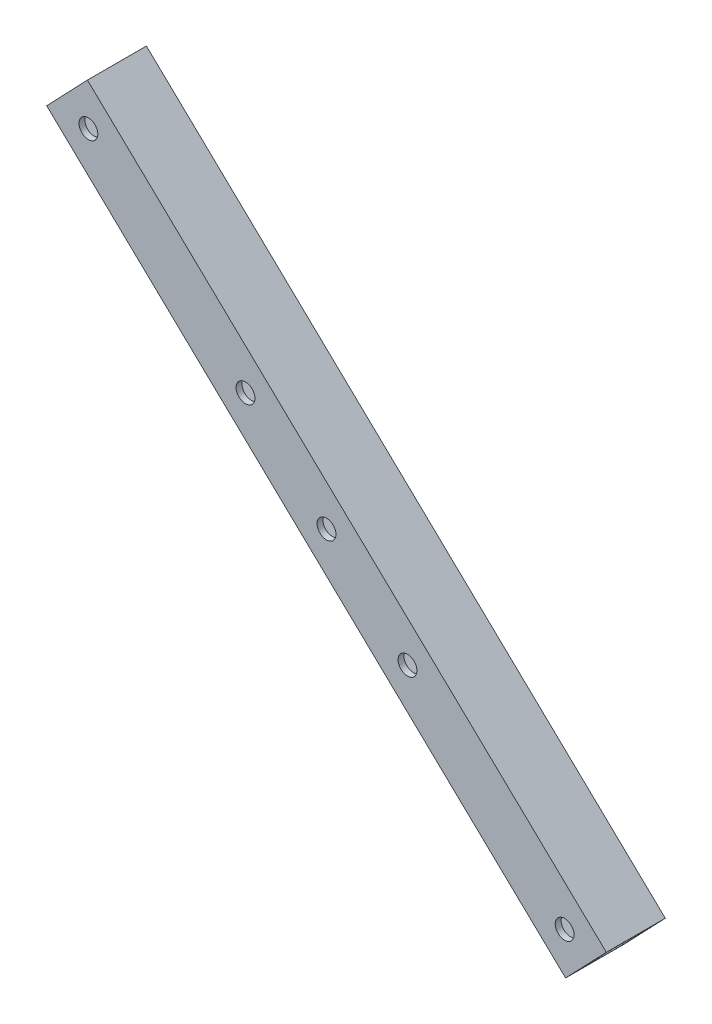
ISO-10303-21;
HEADER;
FILE_DESCRIPTION(('STEP AP214'),'2;1');
FILE_NAME('part.step','',(''),(''),'','','');
FILE_SCHEMA(('AUTOMOTIVE_DESIGN { 1 0 10303 214 1 1 1 1 }'));
ENDSEC;
DATA;
#1=APPLICATION_CONTEXT('core data for automotive mechanical design processes');
#2=APPLICATION_PROTOCOL_DEFINITION('international standard','automotive_design',2000,#1);
#3=PRODUCT_CONTEXT('',#1,'mechanical');
#4=PRODUCT('Part','Part','',(#3));
#5=PRODUCT_RELATED_PRODUCT_CATEGORY('part','',(#4));
#6=PRODUCT_DEFINITION_FORMATION('','',#4);
#7=PRODUCT_DEFINITION_CONTEXT('part definition',#1,'design');
#8=PRODUCT_DEFINITION('design','',#6,#7);
#9=PRODUCT_DEFINITION_SHAPE('','',#8);
#10=(LENGTH_UNIT() NAMED_UNIT(*) SI_UNIT(.MILLI.,.METRE.));
#11=(NAMED_UNIT(*) PLANE_ANGLE_UNIT() SI_UNIT($,.RADIAN.));
#12=(NAMED_UNIT(*) SI_UNIT($,.STERADIAN.) SOLID_ANGLE_UNIT());
#13=UNCERTAINTY_MEASURE_WITH_UNIT(LENGTH_MEASURE(1.E-05),#10,'distance_accuracy_value','');
#14=(GEOMETRIC_REPRESENTATION_CONTEXT(3) GLOBAL_UNCERTAINTY_ASSIGNED_CONTEXT((#13)) GLOBAL_UNIT_ASSIGNED_CONTEXT((#10,
#11,#12)) REPRESENTATION_CONTEXT('',''));
#15=CARTESIAN_POINT('',(0.,0.,0.));
#16=DIRECTION('',(0.,0.,1.));
#17=DIRECTION('',(1.,0.,0.));
#18=AXIS2_PLACEMENT_3D('',#15,#16,#17);
#19=CARTESIAN_POINT('',(-3.77609817293488,84.2848181798707,10.));
#20=DIRECTION('',(0.,0.,-1.));
#21=DIRECTION('',(-1.,0.,0.));
#22=AXIS2_PLACEMENT_3D('',#19,#20,#21);
#23=CYLINDRICAL_SURFACE('',#22,1.6);
#24=CARTESIAN_POINT('',(-3.77609817293488,84.2848181798707,9.));
#25=DIRECTION('',(0.,0.,1.));
#26=DIRECTION('',(1.,0.,0.));
#27=AXIS2_PLACEMENT_3D('',#24,#25,#26);
#28=CIRCLE('',#27,1.6);
#29=CARTESIAN_POINT('',(-2.17609817293488,84.2848181798707,9.));
#30=VERTEX_POINT('',#29);
#31=EDGE_CURVE('E134',#30,#30,#28,.T.);
#32=ORIENTED_EDGE('',*,*,#31,.F.);
#33=EDGE_LOOP('',(#32));
#34=FACE_BOUND('',#33,.T.);
#35=CARTESIAN_POINT('',(-3.77609817293488,84.2848181798707,10.));
#36=DIRECTION('',(0.,0.,1.));
#37=DIRECTION('',(1.,0.,0.));
#38=AXIS2_PLACEMENT_3D('',#35,#36,#37);
#39=CIRCLE('',#38,1.6);
#40=CARTESIAN_POINT('',(-2.17609817293488,84.2848181798707,10.));
#41=VERTEX_POINT('',#40);
#42=EDGE_CURVE('E144',#41,#41,#39,.T.);
#43=ORIENTED_EDGE('',*,*,#42,.T.);
#44=EDGE_LOOP('',(#43));
#45=FACE_BOUND('',#44,.T.);
#46=ADVANCED_FACE('F33',(#34,#45),#23,.F.);
#47=CARTESIAN_POINT('',(76.990408140841,7.09173909976924,10.));
#48=DIRECTION('',(0.,0.,-1.));
#49=DIRECTION('',(-1.,0.,0.));
#50=AXIS2_PLACEMENT_3D('',#47,#48,#49);
#51=CYLINDRICAL_SURFACE('',#50,1.60000000000001);
#52=CARTESIAN_POINT('',(76.990408140841,7.09173909976924,9.));
#53=DIRECTION('',(0.,0.,1.));
#54=DIRECTION('',(1.,0.,0.));
#55=AXIS2_PLACEMENT_3D('',#52,#53,#54);
#56=CIRCLE('',#55,1.60000000000001);
#57=CARTESIAN_POINT('',(78.590408140841,7.09173909976924,9.));
#58=VERTEX_POINT('',#57);
#59=EDGE_CURVE('E133',#58,#58,#56,.T.);
#60=ORIENTED_EDGE('',*,*,#59,.F.);
#61=EDGE_LOOP('',(#60));
#62=FACE_BOUND('',#61,.T.);
#63=CARTESIAN_POINT('',(76.990408140841,7.09173909976924,10.));
#64=DIRECTION('',(0.,0.,1.));
#65=DIRECTION('',(1.,0.,0.));
#66=AXIS2_PLACEMENT_3D('',#63,#64,#65);
#67=CIRCLE('',#66,1.60000000000001);
#68=CARTESIAN_POINT('',(78.590408140841,7.09173909976924,10.));
#69=VERTEX_POINT('',#68);
#70=EDGE_CURVE('E141',#69,#69,#67,.T.);
#71=ORIENTED_EDGE('',*,*,#70,.T.);
#72=EDGE_LOOP('',(#71));
#73=FACE_BOUND('',#72,.T.);
#74=ADVANCED_FACE('F235',(#62,#73),#51,.F.);
#75=CARTESIAN_POINT('',(40.3083714708663,-38.5249709137162,10.));
#76=DIRECTION('',(-0.722918282369836,0.690933540230496,0.));
#77=DIRECTION('',(-0.690933540230496,-0.722918282369836,0.));
#78=AXIS2_PLACEMENT_3D('',#75,#76,#77);
#79=PLANE('',#78);
#80=DIRECTION('',(0.,0.,-1.));
#81=VECTOR('',#80,1.);
#82=CARTESIAN_POINT('',(77.8412653917682,0.745398269137436,9.));
#83=LINE('',#82,#81);
#84=CARTESIAN_POINT('',(77.8412653917682,0.745398269137436,9.));
#85=VERTEX_POINT('',#84);
#86=CARTESIAN_POINT('',(77.8412653917682,0.745398269137436,1.));
#87=VERTEX_POINT('',#86);
#88=EDGE_CURVE('E112',#85,#87,#83,.T.);
#89=ORIENTED_EDGE('',*,*,#88,.F.);
#90=DIRECTION('',(-0.690933540230497,-0.722918282369835,0.));
#91=VECTOR('',#90,1.);
#92=CARTESIAN_POINT('',(77.8412653917682,0.745398269137436,9.));
#93=LINE('',#92,#91);
#94=CARTESIAN_POINT('',(83.3687337136122,6.52874452809612,9.));
#95=VERTEX_POINT('',#94);
#96=EDGE_CURVE('E50',#95,#85,#93,.T.);
#97=ORIENTED_EDGE('',*,*,#96,.F.);
#98=DIRECTION('',(0.,0.,1.));
#99=VECTOR('',#98,1.);
#100=CARTESIAN_POINT('',(83.3687337136122,6.52874452809612,9.));
#101=LINE('',#100,#99);
#102=CARTESIAN_POINT('',(83.3687337136122,6.52874452809612,1.));
#103=VERTEX_POINT('',#102);
#104=EDGE_CURVE('E119',#103,#95,#101,.T.);
#105=ORIENTED_EDGE('',*,*,#104,.F.);
#106=DIRECTION('',(0.690933540230497,0.722918282369835,0.));
#107=VECTOR('',#106,1.);
#108=CARTESIAN_POINT('',(77.8412653917682,0.745398269137436,1.));
#109=LINE('',#108,#107);
#110=EDGE_CURVE('E103',#87,#103,#109,.T.);
#111=ORIENTED_EDGE('',*,*,#110,.F.);
#112=EDGE_LOOP('',(#89,#97,#105,#111));
#113=FACE_BOUND('',#112,.T.);
#114=DIRECTION('',(0.690933540230496,0.722918282369836,0.));
#115=VECTOR('',#114,1.);
#116=CARTESIAN_POINT('',(40.3083714708663,-38.5249709137162,0.));
#117=LINE('',#116,#115);
#118=CARTESIAN_POINT('',(77.1503318515377,0.0224799867676109,0.));
#119=VERTEX_POINT('',#118);
#120=CARTESIAN_POINT('',(84.0596672538427,7.25166281046594,0.));
#121=VERTEX_POINT('',#120);
#122=EDGE_CURVE('E163',#119,#121,#117,.T.);
#123=ORIENTED_EDGE('',*,*,#122,.T.);
#124=DIRECTION('',(0.,0.,-1.));
#125=VECTOR('',#124,1.);
#126=CARTESIAN_POINT('',(84.0596672538427,7.25166281046594,10.));
#127=LINE('',#126,#125);
#128=CARTESIAN_POINT('',(84.0596672538427,7.25166281046594,10.));
#129=VERTEX_POINT('',#128);
#130=EDGE_CURVE('E179',#129,#121,#127,.T.);
#131=ORIENTED_EDGE('',*,*,#130,.F.);
#132=DIRECTION('',(0.690933540230496,0.722918282369836,0.));
#133=VECTOR('',#132,1.);
#134=CARTESIAN_POINT('',(40.3083714708663,-38.5249709137162,10.));
#135=LINE('',#134,#133);
#136=CARTESIAN_POINT('',(77.1503318515377,0.0224799867676109,10.));
#137=VERTEX_POINT('',#136);
#138=EDGE_CURVE('E148',#137,#129,#135,.T.);
#139=ORIENTED_EDGE('',*,*,#138,.F.);
#140=DIRECTION('',(0.,0.,-1.));
#141=VECTOR('',#140,1.);
#142=CARTESIAN_POINT('',(77.1503318515377,0.0224799867676109,10.));
#143=LINE('',#142,#141);
#144=EDGE_CURVE('E157',#137,#119,#143,.T.);
#145=ORIENTED_EDGE('',*,*,#144,.T.);
#146=EDGE_LOOP('',(#123,#131,#139,#145));
#147=FACE_BOUND('',#146,.T.);
#148=ADVANCED_FACE('F116',(#113,#147),#79,.F.);
#149=CARTESIAN_POINT('',(43.7512957829762,45.7766337241822,10.));
#150=DIRECTION('',(-0.690933540230495,-0.722918282369837,0.));
#151=DIRECTION('',(0.722918282369837,-0.690933540230495,0.));
#152=AXIS2_PLACEMENT_3D('',#149,#150,#151);
#153=PLANE('',#152);
#154=DIRECTION('',(-0.722918282369837,0.690933540230495,0.));
#155=VECTOR('',#154,1.);
#156=CARTESIAN_POINT('',(43.7512957829762,45.7766337241822,0.));
#157=LINE('',#156,#155);
#158=CARTESIAN_POINT('',(-3.93602188363157,91.3540772928723,0.));
#159=VERTEX_POINT('',#158);
#160=EDGE_CURVE('E166',#121,#159,#157,.T.);
#161=ORIENTED_EDGE('',*,*,#160,.T.);
#162=DIRECTION('',(0.,0.,-1.));
#163=VECTOR('',#162,1.);
#164=CARTESIAN_POINT('',(-3.93602188363157,91.3540772928723,10.));
#165=LINE('',#164,#163);
#166=CARTESIAN_POINT('',(-3.93602188363157,91.3540772928723,10.));
#167=VERTEX_POINT('',#166);
#168=EDGE_CURVE('E176',#167,#159,#165,.T.);
#169=ORIENTED_EDGE('',*,*,#168,.F.);
#170=DIRECTION('',(-0.722918282369837,0.690933540230495,0.));
#171=VECTOR('',#170,1.);
#172=CARTESIAN_POINT('',(43.7512957829762,45.7766337241822,10.));
#173=LINE('',#172,#171);
#174=EDGE_CURVE('E151',#129,#167,#173,.T.);
#175=ORIENTED_EDGE('',*,*,#174,.F.);
#176=ORIENTED_EDGE('',*,*,#130,.T.);
#177=EDGE_LOOP('',(#161,#169,#175,#176));
#178=FACE_BOUND('',#177,.T.);
#179=ADVANCED_FACE('F254',(#178),#153,.F.);
#180=CARTESIAN_POINT('',(-47.6873176666079,45.5774435686902,10.));
#181=DIRECTION('',(0.722918282369836,-0.690933540230496,0.));
#182=DIRECTION('',(0.690933540230496,0.722918282369836,0.));
#183=AXIS2_PLACEMENT_3D('',#180,#181,#182);
#184=PLANE('',#183);
#185=DIRECTION('',(0.,0.,1.));
#186=VECTOR('',#185,1.);
#187=CARTESIAN_POINT('',(-4.626955423862,90.6311590105026,10.));
#188=LINE('',#187,#186);
#189=CARTESIAN_POINT('',(-4.626955423862,90.6311590105026,1.));
#190=VERTEX_POINT('',#189);
#191=CARTESIAN_POINT('',(-4.626955423862,90.6311590105026,9.));
#192=VERTEX_POINT('',#191);
#193=EDGE_CURVE('E11',#190,#192,#188,.T.);
#194=ORIENTED_EDGE('',*,*,#193,.T.);
#195=DIRECTION('',(-0.690933540230496,-0.722918282369836,0.));
#196=VECTOR('',#195,1.);
#197=CARTESIAN_POINT('',(-47.6873176666079,45.5774435686902,9.));
#198=LINE('',#197,#196);
#199=CARTESIAN_POINT('',(-10.154423745706,84.8478127515439,9.));
#200=VERTEX_POINT('',#199);
#201=EDGE_CURVE('E137',#192,#200,#198,.T.);
#202=ORIENTED_EDGE('',*,*,#201,.T.);
#203=DIRECTION('',(0.,0.,-1.));
#204=VECTOR('',#203,1.);
#205=CARTESIAN_POINT('',(-10.154423745706,84.8478127515439,10.));
#206=LINE('',#205,#204);
#207=CARTESIAN_POINT('',(-10.154423745706,84.8478127515439,1.));
#208=VERTEX_POINT('',#207);
#209=EDGE_CURVE('E42',#200,#208,#206,.T.);
#210=ORIENTED_EDGE('',*,*,#209,.T.);
#211=DIRECTION('',(0.690933540230496,0.722918282369836,0.));
#212=VECTOR('',#211,1.);
#213=CARTESIAN_POINT('',(-47.6873176666079,45.5774435686902,1.));
#214=LINE('',#213,#212);
#215=EDGE_CURVE('E106',#208,#190,#214,.T.);
#216=ORIENTED_EDGE('',*,*,#215,.T.);
#217=EDGE_LOOP('',(#194,#202,#210,#216));
#218=FACE_BOUND('',#217,.T.);
#219=DIRECTION('',(-0.690933540230496,-0.722918282369836,0.));
#220=VECTOR('',#219,1.);
#221=CARTESIAN_POINT('',(-47.6873176666079,45.5774435686902,0.));
#222=LINE('',#221,#220);
#223=CARTESIAN_POINT('',(-10.8453572859366,84.124894469174,0.));
#224=VERTEX_POINT('',#223);
#225=EDGE_CURVE('E168',#159,#224,#222,.T.);
#226=ORIENTED_EDGE('',*,*,#225,.T.);
#227=DIRECTION('',(0.,0.,-1.));
#228=VECTOR('',#227,1.);
#229=CARTESIAN_POINT('',(-10.8453572859366,84.124894469174,10.));
#230=LINE('',#229,#228);
#231=CARTESIAN_POINT('',(-10.8453572859366,84.124894469174,10.));
#232=VERTEX_POINT('',#231);
#233=EDGE_CURVE('E173',#232,#224,#230,.T.);
#234=ORIENTED_EDGE('',*,*,#233,.F.);
#235=DIRECTION('',(-0.690933540230496,-0.722918282369836,0.));
#236=VECTOR('',#235,1.);
#237=CARTESIAN_POINT('',(-47.6873176666079,45.5774435686902,10.));
#238=LINE('',#237,#236);
#239=EDGE_CURVE('E153',#167,#232,#238,.T.);
#240=ORIENTED_EDGE('',*,*,#239,.F.);
#241=ORIENTED_EDGE('',*,*,#168,.T.);
#242=EDGE_LOOP('',(#226,#234,#240,#241));
#243=FACE_BOUND('',#242,.T.);
#244=ADVANCED_FACE('F246',(#218,#243),#184,.F.);
#245=CARTESIAN_POINT('',(-3.77609817293488,84.2848181798707,1.));
#246=DIRECTION('',(0.,0.,-1.));
#247=DIRECTION('',(-1.,0.,0.));
#248=AXIS2_PLACEMENT_3D('',#245,#246,#247);
#249=CIRCLE('',#248,1.6);
#250=CARTESIAN_POINT('',(-5.37609817293488,84.2848181798707,1.));
#251=VERTEX_POINT('',#250);
#252=EDGE_CURVE('E129',#251,#251,#249,.T.);
#253=ORIENTED_EDGE('',*,*,#252,.F.);
#254=EDGE_LOOP('',(#253));
#255=FACE_BOUND('',#254,.T.);
#256=CARTESIAN_POINT('',(-3.77609817293488,84.2848181798707,0.));
#257=DIRECTION('',(0.,0.,1.));
#258=DIRECTION('',(1.,0.,0.));
#259=AXIS2_PLACEMENT_3D('',#256,#257,#258);
#260=CIRCLE('',#259,1.6);
#261=CARTESIAN_POINT('',(-2.17609817293488,84.2848181798707,0.));
#262=VERTEX_POINT('',#261);
#263=EDGE_CURVE('E160',#262,#262,#260,.T.);
#264=ORIENTED_EDGE('',*,*,#263,.F.);
#265=EDGE_LOOP('',(#264));
#266=FACE_BOUND('',#265,.T.);
#267=ADVANCED_FACE('F237',(#255,#266),#23,.F.);
#268=CARTESIAN_POINT('',(76.990408140841,7.09173909976924,1.));
#269=DIRECTION('',(0.,0.,-1.));
#270=DIRECTION('',(-1.,0.,0.));
#271=AXIS2_PLACEMENT_3D('',#268,#269,#270);
#272=CIRCLE('',#271,1.60000000000001);
#273=CARTESIAN_POINT('',(75.390408140841,7.09173909976924,1.));
#274=VERTEX_POINT('',#273);
#275=EDGE_CURVE('E126',#274,#274,#272,.T.);
#276=ORIENTED_EDGE('',*,*,#275,.F.);
#277=EDGE_LOOP('',(#276));
#278=FACE_BOUND('',#277,.T.);
#279=CARTESIAN_POINT('',(76.990408140841,7.09173909976924,0.));
#280=DIRECTION('',(0.,0.,1.));
#281=DIRECTION('',(1.,0.,0.));
#282=AXIS2_PLACEMENT_3D('',#279,#280,#281);
#283=CIRCLE('',#282,1.60000000000001);
#284=CARTESIAN_POINT('',(78.590408140841,7.09173909976924,0.));
#285=VERTEX_POINT('',#284);
#286=EDGE_CURVE('E140',#285,#285,#283,.T.);
#287=ORIENTED_EDGE('',*,*,#286,.F.);
#288=EDGE_LOOP('',(#287));
#289=FACE_BOUND('',#288,.T.);
#290=ADVANCED_FACE('F35',(#278,#289),#51,.F.);
#291=CARTESIAN_POINT('',(36.8419603806713,38.5474509004838,10.));
#292=DIRECTION('',(0.690933540230495,0.722918282369836,0.));
#293=DIRECTION('',(-0.722918282369836,0.690933540230495,0.));
#294=AXIS2_PLACEMENT_3D('',#291,#292,#293);
#295=PLANE('',#294);
#296=DIRECTION('',(0.722918282369836,-0.690933540230495,0.));
#297=VECTOR('',#296,1.);
#298=CARTESIAN_POINT('',(36.8419603806713,38.5474509004838,0.));
#299=LINE('',#298,#297);
#300=EDGE_CURVE('E145',#224,#119,#299,.T.);
#301=ORIENTED_EDGE('',*,*,#300,.T.);
#302=ORIENTED_EDGE('',*,*,#144,.F.);
#303=DIRECTION('',(0.722918282369836,-0.690933540230495,0.));
#304=VECTOR('',#303,1.);
#305=CARTESIAN_POINT('',(36.8419603806713,38.5474509004838,10.));
#306=LINE('',#305,#304);
#307=EDGE_CURVE('E155',#232,#137,#306,.T.);
#308=ORIENTED_EDGE('',*,*,#307,.F.);
#309=ORIENTED_EDGE('',*,*,#233,.T.);
#310=EDGE_LOOP('',(#301,#302,#308,#309));
#311=FACE_BOUND('',#310,.T.);
#312=ADVANCED_FACE('F252',(#311),#295,.F.);
#313=CARTESIAN_POINT('',(0.,0.,10.));
#314=DIRECTION('',(0.,0.,1.));
#315=DIRECTION('',(1.,0.,0.));
#316=AXIS2_PLACEMENT_3D('',#313,#314,#315);
#317=PLANE('',#316);
#318=CARTESIAN_POINT('',(22.8717076189262,58.8160159041994,10.));
#319=DIRECTION('',(0.,0.,1.));
#320=DIRECTION('',(1.,0.,0.));
#321=AXIS2_PLACEMENT_3D('',#318,#319,#320);
#322=CIRCLE('',#321,1.60000000000001);
#323=CARTESIAN_POINT('',(24.4717076189262,58.8160159041994,10.));
#324=VERTEX_POINT('',#323);
#325=EDGE_CURVE('E413',#324,#324,#322,.T.);
#326=ORIENTED_EDGE('',*,*,#325,.F.);
#327=EDGE_LOOP('',(#326));
#328=FACE_BOUND('',#327,.T.);
#329=CARTESIAN_POINT('',(50.34260234898,32.5605413754406,10.));
#330=DIRECTION('',(0.,0.,1.));
#331=DIRECTION('',(1.,0.,0.));
#332=AXIS2_PLACEMENT_3D('',#329,#330,#331);
#333=CIRCLE('',#332,1.6);
#334=CARTESIAN_POINT('',(51.94260234898,32.5605413754406,10.));
#335=VERTEX_POINT('',#334);
#336=EDGE_CURVE('E397',#335,#335,#333,.T.);
#337=ORIENTED_EDGE('',*,*,#336,.F.);
#338=EDGE_LOOP('',(#337));
#339=FACE_BOUND('',#338,.T.);
#340=CARTESIAN_POINT('',(36.6071549839531,45.68827863982,10.));
#341=DIRECTION('',(0.,0.,1.));
#342=DIRECTION('',(1.,0.,0.));
#343=AXIS2_PLACEMENT_3D('',#340,#341,#342);
#344=CIRCLE('',#343,1.6);
#345=CARTESIAN_POINT('',(38.2071549839531,45.68827863982,10.));
#346=VERTEX_POINT('',#345);
#347=EDGE_CURVE('E203',#346,#346,#344,.T.);
#348=ORIENTED_EDGE('',*,*,#347,.F.);
#349=EDGE_LOOP('',(#348));
#350=FACE_BOUND('',#349,.T.);
#351=ORIENTED_EDGE('',*,*,#70,.F.);
#352=EDGE_LOOP('',(#351));
#353=FACE_BOUND('',#352,.T.);
#354=ORIENTED_EDGE('',*,*,#42,.F.);
#355=EDGE_LOOP('',(#354));
#356=FACE_BOUND('',#355,.T.);
#357=ORIENTED_EDGE('',*,*,#138,.T.);
#358=ORIENTED_EDGE('',*,*,#174,.T.);
#359=ORIENTED_EDGE('',*,*,#239,.T.);
#360=ORIENTED_EDGE('',*,*,#307,.T.);
#361=EDGE_LOOP('',(#357,#358,#359,#360));
#362=FACE_BOUND('',#361,.T.);
#363=ADVANCED_FACE('F265',(#328,#339,#350,#353,#356,#362),#317,.T.);
#364=CARTESIAN_POINT('',(0.,0.,0.));
#365=DIRECTION('',(0.,0.,1.));
#366=DIRECTION('',(1.,0.,0.));
#367=AXIS2_PLACEMENT_3D('',#364,#365,#366);
#368=PLANE('',#367);
#369=CARTESIAN_POINT('',(22.8717076189262,58.8160159041994,0.));
#370=DIRECTION('',(0.,0.,1.));
#371=DIRECTION('',(1.,0.,0.));
#372=AXIS2_PLACEMENT_3D('',#369,#370,#371);
#373=CIRCLE('',#372,1.60000000000001);
#374=CARTESIAN_POINT('',(24.4717076189262,58.8160159041994,0.));
#375=VERTEX_POINT('',#374);
#376=EDGE_CURVE('E190',#375,#375,#373,.T.);
#377=ORIENTED_EDGE('',*,*,#376,.T.);
#378=EDGE_LOOP('',(#377));
#379=FACE_BOUND('',#378,.T.);
#380=CARTESIAN_POINT('',(50.34260234898,32.5605413754406,0.));
#381=DIRECTION('',(0.,0.,1.));
#382=DIRECTION('',(1.,0.,0.));
#383=AXIS2_PLACEMENT_3D('',#380,#381,#382);
#384=CIRCLE('',#383,1.6);
#385=CARTESIAN_POINT('',(51.94260234898,32.5605413754406,0.));
#386=VERTEX_POINT('',#385);
#387=EDGE_CURVE('E409',#386,#386,#384,.T.);
#388=ORIENTED_EDGE('',*,*,#387,.T.);
#389=EDGE_LOOP('',(#388));
#390=FACE_BOUND('',#389,.T.);
#391=CARTESIAN_POINT('',(36.6071549839531,45.68827863982,0.));
#392=DIRECTION('',(0.,0.,1.));
#393=DIRECTION('',(1.,0.,0.));
#394=AXIS2_PLACEMENT_3D('',#391,#392,#393);
#395=CIRCLE('',#394,1.6);
#396=CARTESIAN_POINT('',(38.2071549839531,45.68827863982,0.));
#397=VERTEX_POINT('',#396);
#398=EDGE_CURVE('E410',#397,#397,#395,.T.);
#399=ORIENTED_EDGE('',*,*,#398,.T.);
#400=EDGE_LOOP('',(#399));
#401=FACE_BOUND('',#400,.T.);
#402=ORIENTED_EDGE('',*,*,#286,.T.);
#403=EDGE_LOOP('',(#402));
#404=FACE_BOUND('',#403,.T.);
#405=ORIENTED_EDGE('',*,*,#263,.T.);
#406=EDGE_LOOP('',(#405));
#407=FACE_BOUND('',#406,.T.);
#408=ORIENTED_EDGE('',*,*,#122,.F.);
#409=ORIENTED_EDGE('',*,*,#300,.F.);
#410=ORIENTED_EDGE('',*,*,#225,.F.);
#411=ORIENTED_EDGE('',*,*,#160,.F.);
#412=EDGE_LOOP('',(#408,#409,#410,#411));
#413=FACE_BOUND('',#412,.T.);
#414=ADVANCED_FACE('F261',(#379,#390,#401,#404,#407,#413),#368,.F.);
#415=CARTESIAN_POINT('',(-8.23784902292359,94.0822925046184,9.));
#416=DIRECTION('',(0.690933540230496,0.722918282369836,0.));
#417=DIRECTION('',(-0.722918282369836,0.690933540230496,0.));
#418=AXIS2_PLACEMENT_3D('',#415,#416,#417);
#419=PLANE('',#418);
#420=DIRECTION('',(0.722918282369836,-0.690933540230496,0.));
#421=VECTOR('',#420,1.);
#422=CARTESIAN_POINT('',(-8.23784902292359,94.0822925046184,1.));
#423=LINE('',#422,#421);
#424=EDGE_CURVE('E108',#190,#103,#423,.T.);
#425=ORIENTED_EDGE('',*,*,#424,.T.);
#426=ORIENTED_EDGE('',*,*,#104,.T.);
#427=DIRECTION('',(0.722918282369836,-0.690933540230496,0.));
#428=VECTOR('',#427,1.);
#429=CARTESIAN_POINT('',(-8.23784902292359,94.0822925046184,9.));
#430=LINE('',#429,#428);
#431=EDGE_CURVE('E124',#192,#95,#430,.T.);
#432=ORIENTED_EDGE('',*,*,#431,.F.);
#433=ORIENTED_EDGE('',*,*,#193,.F.);
#434=EDGE_LOOP('',(#425,#426,#432,#433));
#435=FACE_BOUND('',#434,.T.);
#436=ADVANCED_FACE('F264',(#435),#419,.F.);
#437=CARTESIAN_POINT('',(-13.7653173447676,88.2989462456598,9.));
#438=DIRECTION('',(-0.690933540230496,-0.722918282369836,0.));
#439=DIRECTION('',(0.722918282369836,-0.690933540230496,0.));
#440=AXIS2_PLACEMENT_3D('',#437,#438,#439);
#441=PLANE('',#440);
#442=DIRECTION('',(0.722918282369836,-0.690933540230496,0.));
#443=VECTOR('',#442,1.);
#444=CARTESIAN_POINT('',(-13.7653173447676,88.2989462456598,9.));
#445=LINE('',#444,#443);
#446=EDGE_CURVE('E109',#200,#85,#445,.T.);
#447=ORIENTED_EDGE('',*,*,#446,.T.);
#448=ORIENTED_EDGE('',*,*,#88,.T.);
#449=DIRECTION('',(0.722918282369836,-0.690933540230496,0.));
#450=VECTOR('',#449,1.);
#451=CARTESIAN_POINT('',(-13.7653173447676,88.2989462456598,1.));
#452=LINE('',#451,#450);
#453=EDGE_CURVE('E58',#208,#87,#452,.T.);
#454=ORIENTED_EDGE('',*,*,#453,.F.);
#455=ORIENTED_EDGE('',*,*,#209,.F.);
#456=EDGE_LOOP('',(#447,#448,#454,#455));
#457=FACE_BOUND('',#456,.T.);
#458=ADVANCED_FACE('F113',(#457),#441,.F.);
#459=CARTESIAN_POINT('',(-13.7653173447676,88.2989462456598,9.));
#460=DIRECTION('',(0.,0.,1.));
#461=DIRECTION('',(1.,0.,0.));
#462=AXIS2_PLACEMENT_3D('',#459,#460,#461);
#463=PLANE('',#462);
#464=CARTESIAN_POINT('',(22.8717076189262,58.8160159041994,9.));
#465=DIRECTION('',(0.,0.,1.));
#466=DIRECTION('',(1.,0.,0.));
#467=AXIS2_PLACEMENT_3D('',#464,#465,#466);
#468=CIRCLE('',#467,1.60000000000001);
#469=CARTESIAN_POINT('',(24.4717076189262,58.8160159041994,9.));
#470=VERTEX_POINT('',#469);
#471=EDGE_CURVE('E206',#470,#470,#468,.T.);
#472=ORIENTED_EDGE('',*,*,#471,.T.);
#473=EDGE_LOOP('',(#472));
#474=FACE_BOUND('',#473,.T.);
#475=CARTESIAN_POINT('',(50.34260234898,32.5605413754406,9.));
#476=DIRECTION('',(0.,0.,1.));
#477=DIRECTION('',(1.,0.,0.));
#478=AXIS2_PLACEMENT_3D('',#475,#476,#477);
#479=CIRCLE('',#478,1.6);
#480=CARTESIAN_POINT('',(51.94260234898,32.5605413754406,9.));
#481=VERTEX_POINT('',#480);
#482=EDGE_CURVE('E193',#481,#481,#479,.T.);
#483=ORIENTED_EDGE('',*,*,#482,.T.);
#484=EDGE_LOOP('',(#483));
#485=FACE_BOUND('',#484,.T.);
#486=CARTESIAN_POINT('',(36.6071549839531,45.68827863982,9.));
#487=DIRECTION('',(0.,0.,1.));
#488=DIRECTION('',(1.,0.,0.));
#489=AXIS2_PLACEMENT_3D('',#486,#487,#488);
#490=CIRCLE('',#489,1.6);
#491=CARTESIAN_POINT('',(38.2071549839531,45.68827863982,9.));
#492=VERTEX_POINT('',#491);
#493=EDGE_CURVE('E189',#492,#492,#490,.T.);
#494=ORIENTED_EDGE('',*,*,#493,.T.);
#495=EDGE_LOOP('',(#494));
#496=FACE_BOUND('',#495,.T.);
#497=ORIENTED_EDGE('',*,*,#31,.T.);
#498=EDGE_LOOP('',(#497));
#499=FACE_BOUND('',#498,.T.);
#500=ORIENTED_EDGE('',*,*,#59,.T.);
#501=EDGE_LOOP('',(#500));
#502=FACE_BOUND('',#501,.T.);
#503=ORIENTED_EDGE('',*,*,#431,.T.);
#504=ORIENTED_EDGE('',*,*,#96,.T.);
#505=ORIENTED_EDGE('',*,*,#446,.F.);
#506=ORIENTED_EDGE('',*,*,#201,.F.);
#507=EDGE_LOOP('',(#503,#504,#505,#506));
#508=FACE_BOUND('',#507,.T.);
#509=ADVANCED_FACE('F293',(#474,#485,#496,#499,#502,#508),#463,.F.);
#510=CARTESIAN_POINT('',(-13.7653173447676,88.2989462456598,1.));
#511=DIRECTION('',(0.,0.,-1.));
#512=DIRECTION('',(-1.,0.,0.));
#513=AXIS2_PLACEMENT_3D('',#510,#511,#512);
#514=PLANE('',#513);
#515=CARTESIAN_POINT('',(22.8717076189262,58.8160159041994,1.));
#516=DIRECTION('',(0.,0.,-1.));
#517=DIRECTION('',(-1.,0.,0.));
#518=AXIS2_PLACEMENT_3D('',#515,#516,#517);
#519=CIRCLE('',#518,1.60000000000001);
#520=CARTESIAN_POINT('',(21.2717076189262,58.8160159041994,1.));
#521=VERTEX_POINT('',#520);
#522=EDGE_CURVE('E37',#521,#521,#519,.T.);
#523=ORIENTED_EDGE('',*,*,#522,.T.);
#524=EDGE_LOOP('',(#523));
#525=FACE_BOUND('',#524,.T.);
#526=CARTESIAN_POINT('',(50.34260234898,32.5605413754406,1.));
#527=DIRECTION('',(0.,0.,-1.));
#528=DIRECTION('',(-1.,0.,0.));
#529=AXIS2_PLACEMENT_3D('',#526,#527,#528);
#530=CIRCLE('',#529,1.6);
#531=CARTESIAN_POINT('',(48.74260234898,32.5605413754406,1.));
#532=VERTEX_POINT('',#531);
#533=EDGE_CURVE('E191',#532,#532,#530,.T.);
#534=ORIENTED_EDGE('',*,*,#533,.T.);
#535=EDGE_LOOP('',(#534));
#536=FACE_BOUND('',#535,.T.);
#537=CARTESIAN_POINT('',(36.6071549839531,45.68827863982,1.));
#538=DIRECTION('',(0.,0.,-1.));
#539=DIRECTION('',(-1.,0.,0.));
#540=AXIS2_PLACEMENT_3D('',#537,#538,#539);
#541=CIRCLE('',#540,1.6);
#542=CARTESIAN_POINT('',(35.0071549839531,45.68827863982,1.));
#543=VERTEX_POINT('',#542);
#544=EDGE_CURVE('E187',#543,#543,#541,.T.);
#545=ORIENTED_EDGE('',*,*,#544,.T.);
#546=EDGE_LOOP('',(#545));
#547=FACE_BOUND('',#546,.T.);
#548=ORIENTED_EDGE('',*,*,#252,.T.);
#549=EDGE_LOOP('',(#548));
#550=FACE_BOUND('',#549,.T.);
#551=ORIENTED_EDGE('',*,*,#275,.T.);
#552=EDGE_LOOP('',(#551));
#553=FACE_BOUND('',#552,.T.);
#554=ORIENTED_EDGE('',*,*,#453,.T.);
#555=ORIENTED_EDGE('',*,*,#110,.T.);
#556=ORIENTED_EDGE('',*,*,#424,.F.);
#557=ORIENTED_EDGE('',*,*,#215,.F.);
#558=EDGE_LOOP('',(#554,#555,#556,#557));
#559=FACE_BOUND('',#558,.T.);
#560=ADVANCED_FACE('F100',(#525,#536,#547,#550,#553,#559),#514,.F.);
#561=CARTESIAN_POINT('',(36.6071549839531,45.68827863982,0.));
#562=DIRECTION('',(0.,0.,1.));
#563=DIRECTION('',(1.,0.,0.));
#564=AXIS2_PLACEMENT_3D('',#561,#562,#563);
#565=CYLINDRICAL_SURFACE('',#564,1.6);
#566=ORIENTED_EDGE('',*,*,#398,.F.);
#567=EDGE_LOOP('',(#566));
#568=FACE_BOUND('',#567,.T.);
#569=ORIENTED_EDGE('',*,*,#544,.F.);
#570=EDGE_LOOP('',(#569));
#571=FACE_BOUND('',#570,.T.);
#572=ADVANCED_FACE('F228',(#568,#571),#565,.F.);
#573=CARTESIAN_POINT('',(50.34260234898,32.5605413754406,0.));
#574=DIRECTION('',(0.,0.,1.));
#575=DIRECTION('',(1.,0.,0.));
#576=AXIS2_PLACEMENT_3D('',#573,#574,#575);
#577=CYLINDRICAL_SURFACE('',#576,1.6);
#578=ORIENTED_EDGE('',*,*,#387,.F.);
#579=EDGE_LOOP('',(#578));
#580=FACE_BOUND('',#579,.T.);
#581=ORIENTED_EDGE('',*,*,#533,.F.);
#582=EDGE_LOOP('',(#581));
#583=FACE_BOUND('',#582,.T.);
#584=ADVANCED_FACE('F217',(#580,#583),#577,.F.);
#585=CARTESIAN_POINT('',(22.8717076189262,58.8160159041994,0.));
#586=DIRECTION('',(0.,0.,1.));
#587=DIRECTION('',(1.,0.,0.));
#588=AXIS2_PLACEMENT_3D('',#585,#586,#587);
#589=CYLINDRICAL_SURFACE('',#588,1.60000000000001);
#590=ORIENTED_EDGE('',*,*,#376,.F.);
#591=EDGE_LOOP('',(#590));
#592=FACE_BOUND('',#591,.T.);
#593=ORIENTED_EDGE('',*,*,#522,.F.);
#594=EDGE_LOOP('',(#593));
#595=FACE_BOUND('',#594,.T.);
#596=ADVANCED_FACE('F214',(#592,#595),#589,.F.);
#597=ORIENTED_EDGE('',*,*,#347,.T.);
#598=EDGE_LOOP('',(#597));
#599=FACE_BOUND('',#598,.T.);
#600=ORIENTED_EDGE('',*,*,#493,.F.);
#601=EDGE_LOOP('',(#600));
#602=FACE_BOUND('',#601,.T.);
#603=ADVANCED_FACE('F216',(#599,#602),#565,.F.);
#604=ORIENTED_EDGE('',*,*,#336,.T.);
#605=EDGE_LOOP('',(#604));
#606=FACE_BOUND('',#605,.T.);
#607=ORIENTED_EDGE('',*,*,#482,.F.);
#608=EDGE_LOOP('',(#607));
#609=FACE_BOUND('',#608,.T.);
#610=ADVANCED_FACE('F225',(#606,#609),#577,.F.);
#611=ORIENTED_EDGE('',*,*,#325,.T.);
#612=EDGE_LOOP('',(#611));
#613=FACE_BOUND('',#612,.T.);
#614=ORIENTED_EDGE('',*,*,#471,.F.);
#615=EDGE_LOOP('',(#614));
#616=FACE_BOUND('',#615,.T.);
#617=ADVANCED_FACE('F220',(#613,#616),#589,.F.);
#618=CLOSED_SHELL('',(#46,#74,#148,#179,#244,#267,#290,#312,#363,#414,#436,#458,#509,#560,#572,
#584,#596,#603,#610,#617));
#619=MANIFOLD_SOLID_BREP('B2',#618);
#620=ADVANCED_BREP_SHAPE_REPRESENTATION('',(#18,#619),#14);
#621=SHAPE_DEFINITION_REPRESENTATION(#9,#620);
ENDSEC;
END-ISO-10303-21;
